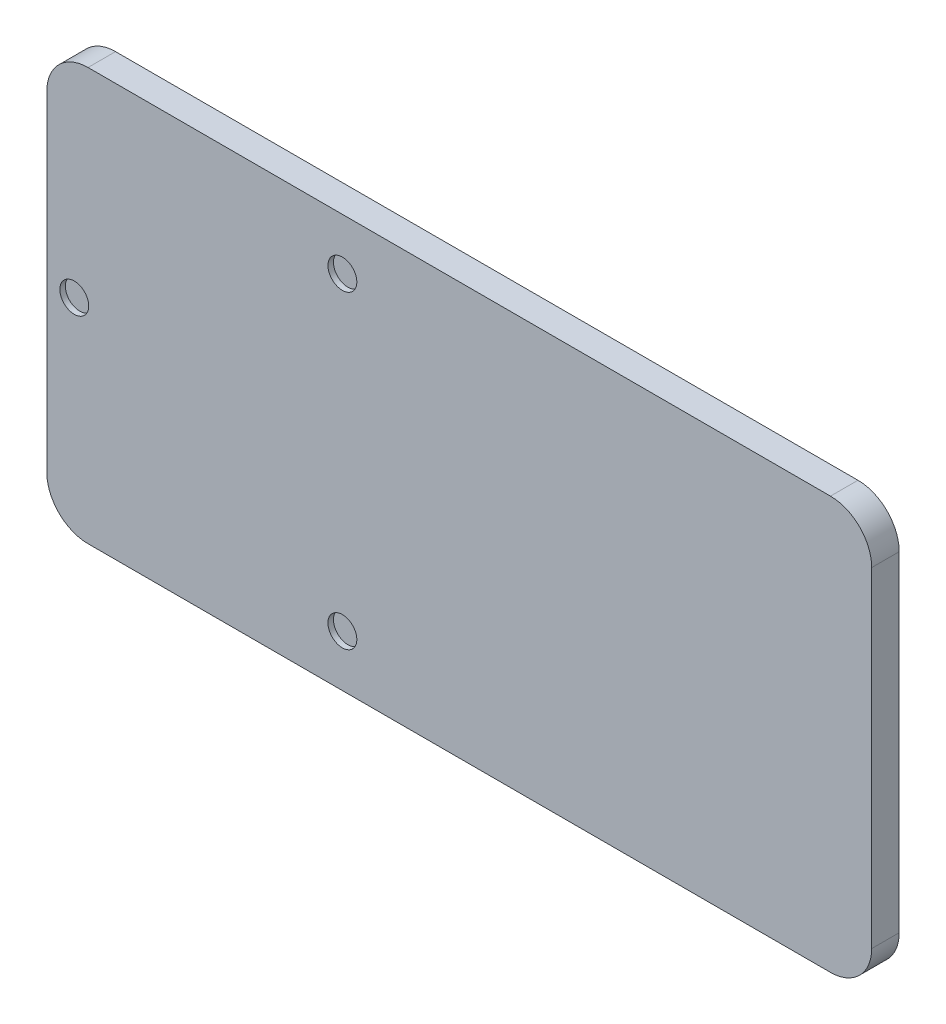
ISO-10303-21;
HEADER;
FILE_DESCRIPTION(('STEP AP214'),'2;1');
FILE_NAME('part.step','',(''),(''),'','','');
FILE_SCHEMA(('AUTOMOTIVE_DESIGN { 1 0 10303 214 1 1 1 1 }'));
ENDSEC;
DATA;
#1=APPLICATION_CONTEXT('core data for automotive mechanical design processes');
#2=APPLICATION_PROTOCOL_DEFINITION('international standard','automotive_design',2000,#1);
#3=PRODUCT_CONTEXT('',#1,'mechanical');
#4=PRODUCT('Part','Part','',(#3));
#5=PRODUCT_RELATED_PRODUCT_CATEGORY('part','',(#4));
#6=PRODUCT_DEFINITION_FORMATION('','',#4);
#7=PRODUCT_DEFINITION_CONTEXT('part definition',#1,'design');
#8=PRODUCT_DEFINITION('design','',#6,#7);
#9=PRODUCT_DEFINITION_SHAPE('','',#8);
#10=(LENGTH_UNIT() NAMED_UNIT(*) SI_UNIT(.MILLI.,.METRE.));
#11=(NAMED_UNIT(*) PLANE_ANGLE_UNIT() SI_UNIT($,.RADIAN.));
#12=(NAMED_UNIT(*) SI_UNIT($,.STERADIAN.) SOLID_ANGLE_UNIT());
#13=UNCERTAINTY_MEASURE_WITH_UNIT(LENGTH_MEASURE(1.E-05),#10,'distance_accuracy_value','');
#14=(GEOMETRIC_REPRESENTATION_CONTEXT(3) GLOBAL_UNCERTAINTY_ASSIGNED_CONTEXT((#13)) GLOBAL_UNIT_ASSIGNED_CONTEXT((#10,
#11,#12)) REPRESENTATION_CONTEXT('',''));
#15=CARTESIAN_POINT('',(0.,0.,0.));
#16=DIRECTION('',(0.,0.,1.));
#17=DIRECTION('',(1.,0.,0.));
#18=AXIS2_PLACEMENT_3D('',#15,#16,#17);
#19=CARTESIAN_POINT('',(150.,-75.,10.));
#20=DIRECTION('',(-1.,0.,0.));
#21=DIRECTION('',(0.,0.,1.));
#22=AXIS2_PLACEMENT_3D('',#19,#20,#21);
#23=PLANE('',#22);
#24=DIRECTION('',(0.,1.,0.));
#25=VECTOR('',#24,1.);
#26=CARTESIAN_POINT('',(150.,-75.,0.));
#27=LINE('',#26,#25);
#28=CARTESIAN_POINT('',(150.,-60.,0.));
#29=VERTEX_POINT('',#28);
#30=CARTESIAN_POINT('',(150.,60.,0.));
#31=VERTEX_POINT('',#30);
#32=EDGE_CURVE('E135',#29,#31,#27,.T.);
#33=ORIENTED_EDGE('',*,*,#32,.T.);
#34=DIRECTION('',(0.,0.,-1.));
#35=VECTOR('',#34,1.);
#36=CARTESIAN_POINT('',(150.,60.,10.));
#37=LINE('',#36,#35);
#38=CARTESIAN_POINT('',(150.,60.,10.));
#39=VERTEX_POINT('',#38);
#40=EDGE_CURVE('E110',#31,#39,#37,.F.);
#41=ORIENTED_EDGE('',*,*,#40,.T.);
#42=DIRECTION('',(0.,1.,0.));
#43=VECTOR('',#42,1.);
#44=CARTESIAN_POINT('',(150.,-75.,10.));
#45=LINE('',#44,#43);
#46=CARTESIAN_POINT('',(150.,-60.,10.));
#47=VERTEX_POINT('',#46);
#48=EDGE_CURVE('E148',#47,#39,#45,.T.);
#49=ORIENTED_EDGE('',*,*,#48,.F.);
#50=DIRECTION('',(0.,0.,-1.));
#51=VECTOR('',#50,1.);
#52=CARTESIAN_POINT('',(150.,-60.,10.));
#53=LINE('',#52,#51);
#54=EDGE_CURVE('E116',#47,#29,#53,.T.);
#55=ORIENTED_EDGE('',*,*,#54,.T.);
#56=EDGE_LOOP('',(#33,#41,#49,#55));
#57=FACE_BOUND('',#56,.T.);
#58=ADVANCED_FACE('F38',(#57),#23,.F.);
#59=CARTESIAN_POINT('',(-150.,75.,10.));
#60=DIRECTION('',(0.,-1.,0.));
#61=DIRECTION('',(0.,0.,-1.));
#62=AXIS2_PLACEMENT_3D('',#59,#60,#61);
#63=PLANE('',#62);
#64=DIRECTION('',(-1.,0.,0.));
#65=VECTOR('',#64,1.);
#66=CARTESIAN_POINT('',(-150.,75.,10.));
#67=LINE('',#66,#65);
#68=CARTESIAN_POINT('',(135.,75.,10.));
#69=VERTEX_POINT('',#68);
#70=CARTESIAN_POINT('',(-135.,75.,10.));
#71=VERTEX_POINT('',#70);
#72=EDGE_CURVE('E126',#69,#71,#67,.T.);
#73=ORIENTED_EDGE('',*,*,#72,.F.);
#74=DIRECTION('',(0.,0.,-1.));
#75=VECTOR('',#74,1.);
#76=CARTESIAN_POINT('',(135.,75.,10.));
#77=LINE('',#76,#75);
#78=CARTESIAN_POINT('',(135.,75.,0.));
#79=VERTEX_POINT('',#78);
#80=EDGE_CURVE('E109',#69,#79,#77,.T.);
#81=ORIENTED_EDGE('',*,*,#80,.T.);
#82=DIRECTION('',(-1.,0.,0.));
#83=VECTOR('',#82,1.);
#84=CARTESIAN_POINT('',(-150.,75.,0.));
#85=LINE('',#84,#83);
#86=CARTESIAN_POINT('',(-135.,75.,0.));
#87=VERTEX_POINT('',#86);
#88=EDGE_CURVE('E123',#79,#87,#85,.T.);
#89=ORIENTED_EDGE('',*,*,#88,.T.);
#90=DIRECTION('',(0.,0.,-1.));
#91=VECTOR('',#90,1.);
#92=CARTESIAN_POINT('',(-135.,75.,10.));
#93=LINE('',#92,#91);
#94=EDGE_CURVE('E129',#87,#71,#93,.F.);
#95=ORIENTED_EDGE('',*,*,#94,.T.);
#96=EDGE_LOOP('',(#73,#81,#89,#95));
#97=FACE_BOUND('',#96,.T.);
#98=ADVANCED_FACE('F122',(#97),#63,.F.);
#99=CARTESIAN_POINT('',(-150.,-75.,10.));
#100=DIRECTION('',(1.,0.,0.));
#101=DIRECTION('',(0.,0.,-1.));
#102=AXIS2_PLACEMENT_3D('',#99,#100,#101);
#103=PLANE('',#102);
#104=DIRECTION('',(0.,-1.,0.));
#105=VECTOR('',#104,1.);
#106=CARTESIAN_POINT('',(-150.,-75.,0.));
#107=LINE('',#106,#105);
#108=CARTESIAN_POINT('',(-150.,60.,0.));
#109=VERTEX_POINT('',#108);
#110=CARTESIAN_POINT('',(-150.,-60.,0.));
#111=VERTEX_POINT('',#110);
#112=EDGE_CURVE('E134',#109,#111,#107,.T.);
#113=ORIENTED_EDGE('',*,*,#112,.T.);
#114=DIRECTION('',(0.,0.,-1.));
#115=VECTOR('',#114,1.);
#116=CARTESIAN_POINT('',(-150.,-60.,10.));
#117=LINE('',#116,#115);
#118=CARTESIAN_POINT('',(-150.,-60.,10.));
#119=VERTEX_POINT('',#118);
#120=EDGE_CURVE('E11',#111,#119,#117,.F.);
#121=ORIENTED_EDGE('',*,*,#120,.T.);
#122=DIRECTION('',(0.,-1.,0.));
#123=VECTOR('',#122,1.);
#124=CARTESIAN_POINT('',(-150.,-75.,10.));
#125=LINE('',#124,#123);
#126=CARTESIAN_POINT('',(-150.,60.,10.));
#127=VERTEX_POINT('',#126);
#128=EDGE_CURVE('E187',#127,#119,#125,.T.);
#129=ORIENTED_EDGE('',*,*,#128,.F.);
#130=DIRECTION('',(0.,0.,-1.));
#131=VECTOR('',#130,1.);
#132=CARTESIAN_POINT('',(-150.,60.,10.));
#133=LINE('',#132,#131);
#134=EDGE_CURVE('E47',#127,#109,#133,.T.);
#135=ORIENTED_EDGE('',*,*,#134,.T.);
#136=EDGE_LOOP('',(#113,#121,#129,#135));
#137=FACE_BOUND('',#136,.T.);
#138=ADVANCED_FACE('F185',(#137),#103,.F.);
#139=CARTESIAN_POINT('',(-150.,-75.,10.));
#140=DIRECTION('',(0.,1.,0.));
#141=DIRECTION('',(0.,0.,1.));
#142=AXIS2_PLACEMENT_3D('',#139,#140,#141);
#143=PLANE('',#142);
#144=DIRECTION('',(1.,0.,0.));
#145=VECTOR('',#144,1.);
#146=CARTESIAN_POINT('',(-150.,-75.,0.));
#147=LINE('',#146,#145);
#148=CARTESIAN_POINT('',(-135.,-75.,0.));
#149=VERTEX_POINT('',#148);
#150=CARTESIAN_POINT('',(135.,-75.,0.));
#151=VERTEX_POINT('',#150);
#152=EDGE_CURVE('E140',#149,#151,#147,.T.);
#153=ORIENTED_EDGE('',*,*,#152,.T.);
#154=DIRECTION('',(0.,0.,-1.));
#155=VECTOR('',#154,1.);
#156=CARTESIAN_POINT('',(135.,-75.,10.));
#157=LINE('',#156,#155);
#158=CARTESIAN_POINT('',(135.,-75.,10.));
#159=VERTEX_POINT('',#158);
#160=EDGE_CURVE('E54',#151,#159,#157,.F.);
#161=ORIENTED_EDGE('',*,*,#160,.T.);
#162=DIRECTION('',(1.,0.,0.));
#163=VECTOR('',#162,1.);
#164=CARTESIAN_POINT('',(-150.,-75.,10.));
#165=LINE('',#164,#163);
#166=CARTESIAN_POINT('',(-135.,-75.,10.));
#167=VERTEX_POINT('',#166);
#168=EDGE_CURVE('E150',#167,#159,#165,.T.);
#169=ORIENTED_EDGE('',*,*,#168,.F.);
#170=DIRECTION('',(0.,0.,-1.));
#171=VECTOR('',#170,1.);
#172=CARTESIAN_POINT('',(-135.,-75.,10.));
#173=LINE('',#172,#171);
#174=EDGE_CURVE('E175',#167,#149,#173,.T.);
#175=ORIENTED_EDGE('',*,*,#174,.T.);
#176=EDGE_LOOP('',(#153,#161,#169,#175));
#177=FACE_BOUND('',#176,.T.);
#178=ADVANCED_FACE('F194',(#177),#143,.F.);
#179=CARTESIAN_POINT('',(0.,0.,10.));
#180=DIRECTION('',(0.,0.,-1.));
#181=DIRECTION('',(-1.,0.,0.));
#182=AXIS2_PLACEMENT_3D('',#179,#180,#181);
#183=PLANE('',#182);
#184=CARTESIAN_POINT('',(-140.,0.,10.));
#185=DIRECTION('',(0.,0.,1.));
#186=DIRECTION('',(1.,0.,0.));
#187=AXIS2_PLACEMENT_3D('',#184,#185,#186);
#188=CIRCLE('',#187,5.25);
#189=CARTESIAN_POINT('',(-134.75,0.,10.));
#190=VERTEX_POINT('',#189);
#191=EDGE_CURVE('E221',#190,#190,#188,.T.);
#192=ORIENTED_EDGE('',*,*,#191,.F.);
#193=EDGE_LOOP('',(#192));
#194=FACE_BOUND('',#193,.T.);
#195=CARTESIAN_POINT('',(-42.4999999999999,56.2916512459885,10.));
#196=DIRECTION('',(0.,0.,1.));
#197=DIRECTION('',(1.,0.,0.));
#198=AXIS2_PLACEMENT_3D('',#195,#196,#197);
#199=CIRCLE('',#198,5.25);
#200=CARTESIAN_POINT('',(-37.2499999999999,56.2916512459885,10.));
#201=VERTEX_POINT('',#200);
#202=EDGE_CURVE('E213',#201,#201,#199,.T.);
#203=ORIENTED_EDGE('',*,*,#202,.F.);
#204=EDGE_LOOP('',(#203));
#205=FACE_BOUND('',#204,.T.);
#206=CARTESIAN_POINT('',(-42.4999999999999,-56.2916512459885,10.));
#207=DIRECTION('',(0.,0.,1.));
#208=DIRECTION('',(1.,0.,0.));
#209=AXIS2_PLACEMENT_3D('',#206,#207,#208);
#210=CIRCLE('',#209,5.25);
#211=CARTESIAN_POINT('',(-37.2499999999999,-56.2916512459885,10.));
#212=VERTEX_POINT('',#211);
#213=EDGE_CURVE('E205',#212,#212,#210,.T.);
#214=ORIENTED_EDGE('',*,*,#213,.F.);
#215=EDGE_LOOP('',(#214));
#216=FACE_BOUND('',#215,.T.);
#217=ORIENTED_EDGE('',*,*,#48,.T.);
#218=CARTESIAN_POINT('',(135.,60.,10.));
#219=DIRECTION('',(0.,0.,-1.));
#220=DIRECTION('',(-1.,0.,0.));
#221=AXIS2_PLACEMENT_3D('',#218,#219,#220);
#222=CIRCLE('',#221,15.);
#223=EDGE_CURVE('E172',#39,#69,#222,.F.);
#224=ORIENTED_EDGE('',*,*,#223,.T.);
#225=ORIENTED_EDGE('',*,*,#72,.T.);
#226=CARTESIAN_POINT('',(-135.,60.,10.));
#227=DIRECTION('',(0.,0.,-1.));
#228=DIRECTION('',(-1.,0.,0.));
#229=AXIS2_PLACEMENT_3D('',#226,#227,#228);
#230=CIRCLE('',#229,15.);
#231=EDGE_CURVE('E164',#71,#127,#230,.F.);
#232=ORIENTED_EDGE('',*,*,#231,.T.);
#233=ORIENTED_EDGE('',*,*,#128,.T.);
#234=CARTESIAN_POINT('',(-135.,-60.,10.));
#235=DIRECTION('',(0.,0.,-1.));
#236=DIRECTION('',(-1.,0.,0.));
#237=AXIS2_PLACEMENT_3D('',#234,#235,#236);
#238=CIRCLE('',#237,15.);
#239=EDGE_CURVE('E61',#119,#167,#238,.F.);
#240=ORIENTED_EDGE('',*,*,#239,.T.);
#241=ORIENTED_EDGE('',*,*,#168,.T.);
#242=CARTESIAN_POINT('',(135.,-60.,10.));
#243=DIRECTION('',(0.,0.,-1.));
#244=DIRECTION('',(-1.,0.,0.));
#245=AXIS2_PLACEMENT_3D('',#242,#243,#244);
#246=CIRCLE('',#245,15.);
#247=EDGE_CURVE('E169',#159,#47,#246,.F.);
#248=ORIENTED_EDGE('',*,*,#247,.T.);
#249=EDGE_LOOP('',(#217,#224,#225,#232,#233,#240,#241,#248));
#250=FACE_BOUND('',#249,.T.);
#251=ADVANCED_FACE('F238',(#194,#205,#216,#250),#183,.F.);
#252=CARTESIAN_POINT('',(0.,0.,0.));
#253=DIRECTION('',(0.,0.,-1.));
#254=DIRECTION('',(-1.,0.,0.));
#255=AXIS2_PLACEMENT_3D('',#252,#253,#254);
#256=PLANE('',#255);
#257=ORIENTED_EDGE('',*,*,#88,.F.);
#258=CARTESIAN_POINT('',(135.,60.,0.));
#259=DIRECTION('',(0.,0.,-1.));
#260=DIRECTION('',(-1.,0.,0.));
#261=AXIS2_PLACEMENT_3D('',#258,#259,#260);
#262=CIRCLE('',#261,15.);
#263=EDGE_CURVE('E105',#79,#31,#262,.T.);
#264=ORIENTED_EDGE('',*,*,#263,.T.);
#265=ORIENTED_EDGE('',*,*,#32,.F.);
#266=CARTESIAN_POINT('',(135.,-60.,0.));
#267=DIRECTION('',(0.,0.,-1.));
#268=DIRECTION('',(-1.,0.,0.));
#269=AXIS2_PLACEMENT_3D('',#266,#267,#268);
#270=CIRCLE('',#269,15.);
#271=EDGE_CURVE('E117',#29,#151,#270,.T.);
#272=ORIENTED_EDGE('',*,*,#271,.T.);
#273=ORIENTED_EDGE('',*,*,#152,.F.);
#274=CARTESIAN_POINT('',(-135.,-60.,0.));
#275=DIRECTION('',(0.,0.,-1.));
#276=DIRECTION('',(-1.,0.,0.));
#277=AXIS2_PLACEMENT_3D('',#274,#275,#276);
#278=CIRCLE('',#277,15.);
#279=EDGE_CURVE('E154',#149,#111,#278,.T.);
#280=ORIENTED_EDGE('',*,*,#279,.T.);
#281=ORIENTED_EDGE('',*,*,#112,.F.);
#282=CARTESIAN_POINT('',(-135.,60.,0.));
#283=DIRECTION('',(0.,0.,-1.));
#284=DIRECTION('',(-1.,0.,0.));
#285=AXIS2_PLACEMENT_3D('',#282,#283,#284);
#286=CIRCLE('',#285,15.);
#287=EDGE_CURVE('E128',#109,#87,#286,.T.);
#288=ORIENTED_EDGE('',*,*,#287,.T.);
#289=EDGE_LOOP('',(#257,#264,#265,#272,#273,#280,#281,#288));
#290=FACE_BOUND('',#289,.T.);
#291=ADVANCED_FACE('F131',(#290),#256,.T.);
#292=CARTESIAN_POINT('',(-42.4999999999999,-56.2916512459885,8.));
#293=DIRECTION('',(0.,0.,1.));
#294=DIRECTION('',(1.,0.,0.));
#295=AXIS2_PLACEMENT_3D('',#292,#293,#294);
#296=CYLINDRICAL_SURFACE('',#295,5.25);
#297=CARTESIAN_POINT('',(-42.4999999999999,-56.2916512459885,8.));
#298=DIRECTION('',(0.,0.,1.));
#299=DIRECTION('',(1.,0.,0.));
#300=AXIS2_PLACEMENT_3D('',#297,#298,#299);
#301=CIRCLE('',#300,5.25);
#302=CARTESIAN_POINT('',(-37.2499999999999,-56.2916512459885,8.));
#303=VERTEX_POINT('',#302);
#304=EDGE_CURVE('E209',#303,#303,#301,.T.);
#305=ORIENTED_EDGE('',*,*,#304,.F.);
#306=EDGE_LOOP('',(#305));
#307=FACE_BOUND('',#306,.T.);
#308=ORIENTED_EDGE('',*,*,#213,.T.);
#309=EDGE_LOOP('',(#308));
#310=FACE_BOUND('',#309,.T.);
#311=ADVANCED_FACE('F270',(#307,#310),#296,.F.);
#312=CARTESIAN_POINT('',(-42.4999999999999,-56.2916512459885,8.));
#313=DIRECTION('',(0.,0.,1.));
#314=DIRECTION('',(1.,0.,0.));
#315=AXIS2_PLACEMENT_3D('',#312,#313,#314);
#316=PLANE('',#315);
#317=ORIENTED_EDGE('',*,*,#304,.T.);
#318=EDGE_LOOP('',(#317));
#319=FACE_BOUND('',#318,.T.);
#320=ADVANCED_FACE('F274',(#319),#316,.T.);
#321=CARTESIAN_POINT('',(-42.4999999999999,56.2916512459885,8.));
#322=DIRECTION('',(0.,0.,1.));
#323=DIRECTION('',(1.,0.,0.));
#324=AXIS2_PLACEMENT_3D('',#321,#322,#323);
#325=CYLINDRICAL_SURFACE('',#324,5.25);
#326=CARTESIAN_POINT('',(-42.4999999999999,56.2916512459885,8.));
#327=DIRECTION('',(0.,0.,1.));
#328=DIRECTION('',(1.,0.,0.));
#329=AXIS2_PLACEMENT_3D('',#326,#327,#328);
#330=CIRCLE('',#329,5.25);
#331=CARTESIAN_POINT('',(-37.2499999999999,56.2916512459885,8.));
#332=VERTEX_POINT('',#331);
#333=EDGE_CURVE('E217',#332,#332,#330,.T.);
#334=ORIENTED_EDGE('',*,*,#333,.F.);
#335=EDGE_LOOP('',(#334));
#336=FACE_BOUND('',#335,.T.);
#337=ORIENTED_EDGE('',*,*,#202,.T.);
#338=EDGE_LOOP('',(#337));
#339=FACE_BOUND('',#338,.T.);
#340=ADVANCED_FACE('F278',(#336,#339),#325,.F.);
#341=CARTESIAN_POINT('',(-42.4999999999999,56.2916512459885,8.));
#342=DIRECTION('',(0.,0.,1.));
#343=DIRECTION('',(1.,0.,0.));
#344=AXIS2_PLACEMENT_3D('',#341,#342,#343);
#345=PLANE('',#344);
#346=ORIENTED_EDGE('',*,*,#333,.T.);
#347=EDGE_LOOP('',(#346));
#348=FACE_BOUND('',#347,.T.);
#349=ADVANCED_FACE('F234',(#348),#345,.T.);
#350=CARTESIAN_POINT('',(-140.,0.,8.));
#351=DIRECTION('',(0.,0.,1.));
#352=DIRECTION('',(1.,0.,0.));
#353=AXIS2_PLACEMENT_3D('',#350,#351,#352);
#354=CYLINDRICAL_SURFACE('',#353,5.25);
#355=CARTESIAN_POINT('',(-140.,0.,8.));
#356=DIRECTION('',(0.,0.,1.));
#357=DIRECTION('',(1.,0.,0.));
#358=AXIS2_PLACEMENT_3D('',#355,#356,#357);
#359=CIRCLE('',#358,5.25);
#360=CARTESIAN_POINT('',(-134.75,0.,8.));
#361=VERTEX_POINT('',#360);
#362=EDGE_CURVE('E142',#361,#361,#359,.T.);
#363=ORIENTED_EDGE('',*,*,#362,.F.);
#364=EDGE_LOOP('',(#363));
#365=FACE_BOUND('',#364,.T.);
#366=ORIENTED_EDGE('',*,*,#191,.T.);
#367=EDGE_LOOP('',(#366));
#368=FACE_BOUND('',#367,.T.);
#369=ADVANCED_FACE('F231',(#365,#368),#354,.F.);
#370=CARTESIAN_POINT('',(-140.,0.,8.));
#371=DIRECTION('',(0.,0.,1.));
#372=DIRECTION('',(1.,0.,0.));
#373=AXIS2_PLACEMENT_3D('',#370,#371,#372);
#374=PLANE('',#373);
#375=ORIENTED_EDGE('',*,*,#362,.T.);
#376=EDGE_LOOP('',(#375));
#377=FACE_BOUND('',#376,.T.);
#378=ADVANCED_FACE('F229',(#377),#374,.T.);
#379=CARTESIAN_POINT('',(135.,60.,10.));
#380=DIRECTION('',(0.,0.,-1.));
#381=DIRECTION('',(-1.,0.,0.));
#382=AXIS2_PLACEMENT_3D('',#379,#380,#381);
#383=CYLINDRICAL_SURFACE('',#382,15.);
#384=ORIENTED_EDGE('',*,*,#223,.F.);
#385=ORIENTED_EDGE('',*,*,#40,.F.);
#386=ORIENTED_EDGE('',*,*,#263,.F.);
#387=ORIENTED_EDGE('',*,*,#80,.F.);
#388=EDGE_LOOP('',(#384,#385,#386,#387));
#389=FACE_BOUND('',#388,.T.);
#390=ADVANCED_FACE('F108',(#389),#383,.T.);
#391=CARTESIAN_POINT('',(135.,-60.,10.));
#392=DIRECTION('',(0.,0.,-1.));
#393=DIRECTION('',(-1.,0.,0.));
#394=AXIS2_PLACEMENT_3D('',#391,#392,#393);
#395=CYLINDRICAL_SURFACE('',#394,15.);
#396=ORIENTED_EDGE('',*,*,#247,.F.);
#397=ORIENTED_EDGE('',*,*,#160,.F.);
#398=ORIENTED_EDGE('',*,*,#271,.F.);
#399=ORIENTED_EDGE('',*,*,#54,.F.);
#400=EDGE_LOOP('',(#396,#397,#398,#399));
#401=FACE_BOUND('',#400,.T.);
#402=ADVANCED_FACE('F249',(#401),#395,.T.);
#403=CARTESIAN_POINT('',(-135.,-60.,10.));
#404=DIRECTION('',(0.,0.,-1.));
#405=DIRECTION('',(-1.,0.,0.));
#406=AXIS2_PLACEMENT_3D('',#403,#404,#405);
#407=CYLINDRICAL_SURFACE('',#406,15.);
#408=ORIENTED_EDGE('',*,*,#239,.F.);
#409=ORIENTED_EDGE('',*,*,#120,.F.);
#410=ORIENTED_EDGE('',*,*,#279,.F.);
#411=ORIENTED_EDGE('',*,*,#174,.F.);
#412=EDGE_LOOP('',(#408,#409,#410,#411));
#413=FACE_BOUND('',#412,.T.);
#414=ADVANCED_FACE('F193',(#413),#407,.T.);
#415=CARTESIAN_POINT('',(-135.,60.,10.));
#416=DIRECTION('',(0.,0.,-1.));
#417=DIRECTION('',(-1.,0.,0.));
#418=AXIS2_PLACEMENT_3D('',#415,#416,#417);
#419=CYLINDRICAL_SURFACE('',#418,15.);
#420=ORIENTED_EDGE('',*,*,#231,.F.);
#421=ORIENTED_EDGE('',*,*,#94,.F.);
#422=ORIENTED_EDGE('',*,*,#287,.F.);
#423=ORIENTED_EDGE('',*,*,#134,.F.);
#424=EDGE_LOOP('',(#420,#421,#422,#423));
#425=FACE_BOUND('',#424,.T.);
#426=ADVANCED_FACE('F40',(#425),#419,.T.);
#427=CLOSED_SHELL('',(#58,#98,#138,#178,#251,#291,#311,#320,#340,#349,#369,#378,#390,#402,#414,#426));
#428=MANIFOLD_SOLID_BREP('B2',#427);
#429=ADVANCED_BREP_SHAPE_REPRESENTATION('',(#18,#428),#14);
#430=SHAPE_DEFINITION_REPRESENTATION(#9,#429);
ENDSEC;
END-ISO-10303-21;
